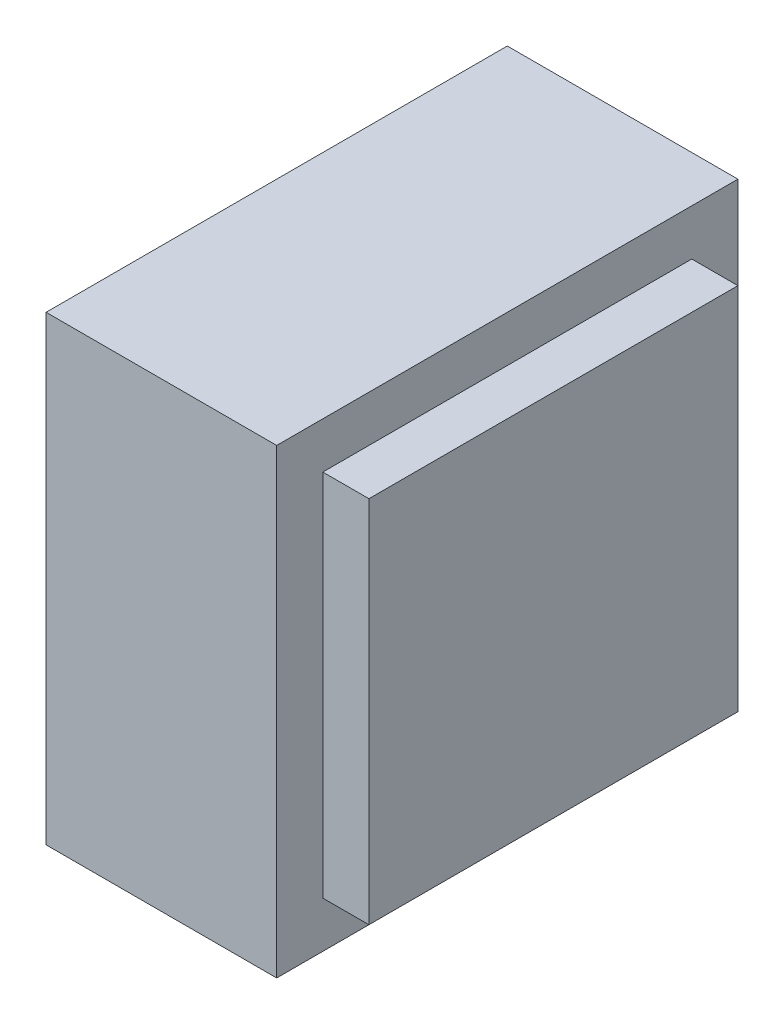
ISO-10303-21;
HEADER;
FILE_DESCRIPTION(('STEP AP214'),'2;1');
FILE_NAME('part.step','',(''),(''),'','','');
FILE_SCHEMA(('AUTOMOTIVE_DESIGN { 1 0 10303 214 1 1 1 1 }'));
ENDSEC;
DATA;
#1=APPLICATION_CONTEXT('core data for automotive mechanical design processes');
#2=APPLICATION_PROTOCOL_DEFINITION('international standard','automotive_design',2000,#1);
#3=PRODUCT_CONTEXT('',#1,'mechanical');
#4=PRODUCT('Part','Part','',(#3));
#5=PRODUCT_RELATED_PRODUCT_CATEGORY('part','',(#4));
#6=PRODUCT_DEFINITION_FORMATION('','',#4);
#7=PRODUCT_DEFINITION_CONTEXT('part definition',#1,'design');
#8=PRODUCT_DEFINITION('design','',#6,#7);
#9=PRODUCT_DEFINITION_SHAPE('','',#8);
#10=(LENGTH_UNIT() NAMED_UNIT(*) SI_UNIT(.MILLI.,.METRE.));
#11=(NAMED_UNIT(*) PLANE_ANGLE_UNIT() SI_UNIT($,.RADIAN.));
#12=(NAMED_UNIT(*) SI_UNIT($,.STERADIAN.) SOLID_ANGLE_UNIT());
#13=UNCERTAINTY_MEASURE_WITH_UNIT(LENGTH_MEASURE(1.E-05),#10,'distance_accuracy_value','');
#14=(GEOMETRIC_REPRESENTATION_CONTEXT(3) GLOBAL_UNCERTAINTY_ASSIGNED_CONTEXT((#13)) GLOBAL_UNIT_ASSIGNED_CONTEXT((#10,
#11,#12)) REPRESENTATION_CONTEXT('',''));
#15=CARTESIAN_POINT('',(0.,0.,0.));
#16=DIRECTION('',(0.,0.,1.));
#17=DIRECTION('',(1.,0.,0.));
#18=AXIS2_PLACEMENT_3D('',#15,#16,#17);
#19=CARTESIAN_POINT('',(1.,0.,0.));
#20=DIRECTION('',(1.,0.,0.));
#21=DIRECTION('',(0.,0.,-1.));
#22=AXIS2_PLACEMENT_3D('',#19,#20,#21);
#23=PLANE('',#22);
#24=DIRECTION('',(0.,1.,0.));
#25=VECTOR('',#24,1.);
#26=CARTESIAN_POINT('',(1.,1.,-1.));
#27=LINE('',#26,#25);
#28=CARTESIAN_POINT('',(1.,-1.,-1.));
#29=VERTEX_POINT('',#28);
#30=CARTESIAN_POINT('',(1.,1.,-1.));
#31=VERTEX_POINT('',#30);
#32=EDGE_CURVE('E141',#29,#31,#27,.T.);
#33=ORIENTED_EDGE('',*,*,#32,.T.);
#34=DIRECTION('',(0.,0.,1.));
#35=VECTOR('',#34,1.);
#36=CARTESIAN_POINT('',(1.,1.,1.));
#37=LINE('',#36,#35);
#38=CARTESIAN_POINT('',(1.,1.,1.));
#39=VERTEX_POINT('',#38);
#40=EDGE_CURVE('E86',#31,#39,#37,.T.);
#41=ORIENTED_EDGE('',*,*,#40,.T.);
#42=DIRECTION('',(0.,-1.,0.));
#43=VECTOR('',#42,1.);
#44=CARTESIAN_POINT('',(1.,1.,1.));
#45=LINE('',#44,#43);
#46=CARTESIAN_POINT('',(1.,-1.,1.));
#47=VERTEX_POINT('',#46);
#48=EDGE_CURVE('E144',#39,#47,#45,.T.);
#49=ORIENTED_EDGE('',*,*,#48,.T.);
#50=DIRECTION('',(0.,0.,-1.));
#51=VECTOR('',#50,1.);
#52=CARTESIAN_POINT('',(1.,-1.,1.));
#53=LINE('',#52,#51);
#54=EDGE_CURVE('E58',#47,#29,#53,.T.);
#55=ORIENTED_EDGE('',*,*,#54,.T.);
#56=EDGE_LOOP('',(#33,#41,#49,#55));
#57=FACE_BOUND('',#56,.T.);
#58=DIRECTION('',(0.,0.,1.));
#59=VECTOR('',#58,1.);
#60=CARTESIAN_POINT('',(1.,0.8,0.8));
#61=LINE('',#60,#59);
#62=CARTESIAN_POINT('',(1.,0.8,-0.8));
#63=VERTEX_POINT('',#62);
#64=CARTESIAN_POINT('',(1.,0.8,0.8));
#65=VERTEX_POINT('',#64);
#66=EDGE_CURVE('E268',#63,#65,#61,.T.);
#67=ORIENTED_EDGE('',*,*,#66,.F.);
#68=DIRECTION('',(0.,1.,0.));
#69=VECTOR('',#68,1.);
#70=CARTESIAN_POINT('',(1.,0.8,-0.8));
#71=LINE('',#70,#69);
#72=CARTESIAN_POINT('',(1.,-0.8,-0.8));
#73=VERTEX_POINT('',#72);
#74=EDGE_CURVE('E131',#73,#63,#71,.T.);
#75=ORIENTED_EDGE('',*,*,#74,.F.);
#76=DIRECTION('',(0.,0.,-1.));
#77=VECTOR('',#76,1.);
#78=CARTESIAN_POINT('',(1.,-0.8,0.8));
#79=LINE('',#78,#77);
#80=CARTESIAN_POINT('',(1.,-0.8,0.8));
#81=VERTEX_POINT('',#80);
#82=EDGE_CURVE('E127',#81,#73,#79,.T.);
#83=ORIENTED_EDGE('',*,*,#82,.F.);
#84=DIRECTION('',(0.,-1.,0.));
#85=VECTOR('',#84,1.);
#86=CARTESIAN_POINT('',(1.,0.8,0.8));
#87=LINE('',#86,#85);
#88=EDGE_CURVE('E265',#65,#81,#87,.T.);
#89=ORIENTED_EDGE('',*,*,#88,.F.);
#90=EDGE_LOOP('',(#67,#75,#83,#89));
#91=FACE_BOUND('',#90,.T.);
#92=ADVANCED_FACE('F34',(#57,#91),#23,.T.);
#93=CARTESIAN_POINT('',(1.,1.,-1.));
#94=DIRECTION('',(0.,0.,1.));
#95=DIRECTION('',(0.,-1.,0.));
#96=AXIS2_PLACEMENT_3D('',#93,#94,#95);
#97=PLANE('',#96);
#98=DIRECTION('',(0.,1.,0.));
#99=VECTOR('',#98,1.);
#100=CARTESIAN_POINT('',(0.,1.,-1.));
#101=LINE('',#100,#99);
#102=CARTESIAN_POINT('',(0.,-1.,-1.));
#103=VERTEX_POINT('',#102);
#104=CARTESIAN_POINT('',(0.,1.,-1.));
#105=VERTEX_POINT('',#104);
#106=EDGE_CURVE('E133',#103,#105,#101,.T.);
#107=ORIENTED_EDGE('',*,*,#106,.T.);
#108=DIRECTION('',(-1.,0.,0.));
#109=VECTOR('',#108,1.);
#110=CARTESIAN_POINT('',(1.,1.,-1.));
#111=LINE('',#110,#109);
#112=EDGE_CURVE('E11',#31,#105,#111,.T.);
#113=ORIENTED_EDGE('',*,*,#112,.F.);
#114=ORIENTED_EDGE('',*,*,#32,.F.);
#115=DIRECTION('',(-1.,0.,0.));
#116=VECTOR('',#115,1.);
#117=CARTESIAN_POINT('',(1.,-1.,-1.));
#118=LINE('',#117,#116);
#119=EDGE_CURVE('E146',#29,#103,#118,.T.);
#120=ORIENTED_EDGE('',*,*,#119,.T.);
#121=EDGE_LOOP('',(#107,#113,#114,#120));
#122=FACE_BOUND('',#121,.T.);
#123=ADVANCED_FACE('F36',(#122),#97,.F.);
#124=CARTESIAN_POINT('',(1.,1.,1.));
#125=DIRECTION('',(0.,-1.,0.));
#126=DIRECTION('',(0.,0.,-1.));
#127=AXIS2_PLACEMENT_3D('',#124,#125,#126);
#128=PLANE('',#127);
#129=DIRECTION('',(0.,0.,1.));
#130=VECTOR('',#129,1.);
#131=CARTESIAN_POINT('',(0.,1.,1.));
#132=LINE('',#131,#130);
#133=CARTESIAN_POINT('',(0.,1.,1.));
#134=VERTEX_POINT('',#133);
#135=EDGE_CURVE('E136',#105,#134,#132,.T.);
#136=ORIENTED_EDGE('',*,*,#135,.T.);
#137=DIRECTION('',(-1.,0.,0.));
#138=VECTOR('',#137,1.);
#139=CARTESIAN_POINT('',(1.,1.,1.));
#140=LINE('',#139,#138);
#141=EDGE_CURVE('E42',#39,#134,#140,.T.);
#142=ORIENTED_EDGE('',*,*,#141,.F.);
#143=ORIENTED_EDGE('',*,*,#40,.F.);
#144=ORIENTED_EDGE('',*,*,#112,.T.);
#145=EDGE_LOOP('',(#136,#142,#143,#144));
#146=FACE_BOUND('',#145,.T.);
#147=ADVANCED_FACE('F175',(#146),#128,.F.);
#148=CARTESIAN_POINT('',(1.,1.,1.));
#149=DIRECTION('',(0.,0.,-1.));
#150=DIRECTION('',(0.,1.,0.));
#151=AXIS2_PLACEMENT_3D('',#148,#149,#150);
#152=PLANE('',#151);
#153=DIRECTION('',(0.,-1.,0.));
#154=VECTOR('',#153,1.);
#155=CARTESIAN_POINT('',(0.,1.,1.));
#156=LINE('',#155,#154);
#157=CARTESIAN_POINT('',(0.,-1.,1.));
#158=VERTEX_POINT('',#157);
#159=EDGE_CURVE('E149',#134,#158,#156,.T.);
#160=ORIENTED_EDGE('',*,*,#159,.T.);
#161=DIRECTION('',(-1.,0.,0.));
#162=VECTOR('',#161,1.);
#163=CARTESIAN_POINT('',(1.,-1.,1.));
#164=LINE('',#163,#162);
#165=EDGE_CURVE('E153',#47,#158,#164,.T.);
#166=ORIENTED_EDGE('',*,*,#165,.F.);
#167=ORIENTED_EDGE('',*,*,#48,.F.);
#168=ORIENTED_EDGE('',*,*,#141,.T.);
#169=EDGE_LOOP('',(#160,#166,#167,#168));
#170=FACE_BOUND('',#169,.T.);
#171=ADVANCED_FACE('F158',(#170),#152,.F.);
#172=CARTESIAN_POINT('',(1.,-1.,1.));
#173=DIRECTION('',(0.,1.,0.));
#174=DIRECTION('',(0.,0.,1.));
#175=AXIS2_PLACEMENT_3D('',#172,#173,#174);
#176=PLANE('',#175);
#177=DIRECTION('',(0.,0.,-1.));
#178=VECTOR('',#177,1.);
#179=CARTESIAN_POINT('',(0.,-1.,1.));
#180=LINE('',#179,#178);
#181=EDGE_CURVE('E79',#158,#103,#180,.T.);
#182=ORIENTED_EDGE('',*,*,#181,.T.);
#183=ORIENTED_EDGE('',*,*,#119,.F.);
#184=ORIENTED_EDGE('',*,*,#54,.F.);
#185=ORIENTED_EDGE('',*,*,#165,.T.);
#186=EDGE_LOOP('',(#182,#183,#184,#185));
#187=FACE_BOUND('',#186,.T.);
#188=ADVANCED_FACE('F166',(#187),#176,.F.);
#189=CARTESIAN_POINT('',(0.,0.,0.));
#190=DIRECTION('',(1.,0.,0.));
#191=DIRECTION('',(0.,0.,-1.));
#192=AXIS2_PLACEMENT_3D('',#189,#190,#191);
#193=PLANE('',#192);
#194=ORIENTED_EDGE('',*,*,#106,.F.);
#195=ORIENTED_EDGE('',*,*,#181,.F.);
#196=ORIENTED_EDGE('',*,*,#159,.F.);
#197=ORIENTED_EDGE('',*,*,#135,.F.);
#198=EDGE_LOOP('',(#194,#195,#196,#197));
#199=FACE_BOUND('',#198,.T.);
#200=ADVANCED_FACE('F162',(#199),#193,.F.);
#201=CARTESIAN_POINT('',(1.2,0.8,-0.8));
#202=DIRECTION('',(0.,0.,1.));
#203=DIRECTION('',(0.,-1.,0.));
#204=AXIS2_PLACEMENT_3D('',#201,#202,#203);
#205=PLANE('',#204);
#206=ORIENTED_EDGE('',*,*,#74,.T.);
#207=DIRECTION('',(-1.,0.,0.));
#208=VECTOR('',#207,1.);
#209=CARTESIAN_POINT('',(1.2,0.8,-0.8));
#210=LINE('',#209,#208);
#211=CARTESIAN_POINT('',(1.2,0.8,-0.8));
#212=VERTEX_POINT('',#211);
#213=EDGE_CURVE('E112',#212,#63,#210,.T.);
#214=ORIENTED_EDGE('',*,*,#213,.F.);
#215=DIRECTION('',(0.,1.,0.));
#216=VECTOR('',#215,1.);
#217=CARTESIAN_POINT('',(1.2,0.8,-0.8));
#218=LINE('',#217,#216);
#219=CARTESIAN_POINT('',(1.2,-0.8,-0.8));
#220=VERTEX_POINT('',#219);
#221=EDGE_CURVE('E119',#220,#212,#218,.T.);
#222=ORIENTED_EDGE('',*,*,#221,.F.);
#223=DIRECTION('',(-1.,0.,0.));
#224=VECTOR('',#223,1.);
#225=CARTESIAN_POINT('',(1.2,-0.8,-0.8));
#226=LINE('',#225,#224);
#227=EDGE_CURVE('E263',#220,#73,#226,.T.);
#228=ORIENTED_EDGE('',*,*,#227,.T.);
#229=EDGE_LOOP('',(#206,#214,#222,#228));
#230=FACE_BOUND('',#229,.T.);
#231=ADVANCED_FACE('F129',(#230),#205,.F.);
#232=CARTESIAN_POINT('',(1.2,0.8,0.8));
#233=DIRECTION('',(0.,-1.,0.));
#234=DIRECTION('',(0.,0.,-1.));
#235=AXIS2_PLACEMENT_3D('',#232,#233,#234);
#236=PLANE('',#235);
#237=ORIENTED_EDGE('',*,*,#66,.T.);
#238=DIRECTION('',(-1.,0.,0.));
#239=VECTOR('',#238,1.);
#240=CARTESIAN_POINT('',(1.2,0.8,0.8));
#241=LINE('',#240,#239);
#242=CARTESIAN_POINT('',(1.2,0.8,0.8));
#243=VERTEX_POINT('',#242);
#244=EDGE_CURVE('E115',#243,#65,#241,.T.);
#245=ORIENTED_EDGE('',*,*,#244,.F.);
#246=DIRECTION('',(0.,0.,1.));
#247=VECTOR('',#246,1.);
#248=CARTESIAN_POINT('',(1.2,0.8,0.8));
#249=LINE('',#248,#247);
#250=EDGE_CURVE('E108',#212,#243,#249,.T.);
#251=ORIENTED_EDGE('',*,*,#250,.F.);
#252=ORIENTED_EDGE('',*,*,#213,.T.);
#253=EDGE_LOOP('',(#237,#245,#251,#252));
#254=FACE_BOUND('',#253,.T.);
#255=ADVANCED_FACE('F110',(#254),#236,.F.);
#256=CARTESIAN_POINT('',(1.2,0.8,0.8));
#257=DIRECTION('',(0.,0.,-1.));
#258=DIRECTION('',(0.,1.,0.));
#259=AXIS2_PLACEMENT_3D('',#256,#257,#258);
#260=PLANE('',#259);
#261=ORIENTED_EDGE('',*,*,#88,.T.);
#262=DIRECTION('',(-1.,0.,0.));
#263=VECTOR('',#262,1.);
#264=CARTESIAN_POINT('',(1.2,-0.8,0.8));
#265=LINE('',#264,#263);
#266=CARTESIAN_POINT('',(1.2,-0.8,0.8));
#267=VERTEX_POINT('',#266);
#268=EDGE_CURVE('E49',#267,#81,#265,.T.);
#269=ORIENTED_EDGE('',*,*,#268,.F.);
#270=DIRECTION('',(0.,-1.,0.));
#271=VECTOR('',#270,1.);
#272=CARTESIAN_POINT('',(1.2,0.8,0.8));
#273=LINE('',#272,#271);
#274=EDGE_CURVE('E118',#243,#267,#273,.T.);
#275=ORIENTED_EDGE('',*,*,#274,.F.);
#276=ORIENTED_EDGE('',*,*,#244,.T.);
#277=EDGE_LOOP('',(#261,#269,#275,#276));
#278=FACE_BOUND('',#277,.T.);
#279=ADVANCED_FACE('F188',(#278),#260,.F.);
#280=CARTESIAN_POINT('',(1.2,-0.8,0.8));
#281=DIRECTION('',(0.,1.,0.));
#282=DIRECTION('',(0.,0.,1.));
#283=AXIS2_PLACEMENT_3D('',#280,#281,#282);
#284=PLANE('',#283);
#285=ORIENTED_EDGE('',*,*,#82,.T.);
#286=ORIENTED_EDGE('',*,*,#227,.F.);
#287=DIRECTION('',(0.,0.,-1.));
#288=VECTOR('',#287,1.);
#289=CARTESIAN_POINT('',(1.2,-0.8,0.8));
#290=LINE('',#289,#288);
#291=EDGE_CURVE('E123',#267,#220,#290,.T.);
#292=ORIENTED_EDGE('',*,*,#291,.F.);
#293=ORIENTED_EDGE('',*,*,#268,.T.);
#294=EDGE_LOOP('',(#285,#286,#292,#293));
#295=FACE_BOUND('',#294,.T.);
#296=ADVANCED_FACE('F191',(#295),#284,.F.);
#297=CARTESIAN_POINT('',(1.2,0.,0.));
#298=DIRECTION('',(1.,0.,0.));
#299=DIRECTION('',(0.,0.,-1.));
#300=AXIS2_PLACEMENT_3D('',#297,#298,#299);
#301=PLANE('',#300);
#302=ORIENTED_EDGE('',*,*,#221,.T.);
#303=ORIENTED_EDGE('',*,*,#250,.T.);
#304=ORIENTED_EDGE('',*,*,#274,.T.);
#305=ORIENTED_EDGE('',*,*,#291,.T.);
#306=EDGE_LOOP('',(#302,#303,#304,#305));
#307=FACE_BOUND('',#306,.T.);
#308=ADVANCED_FACE('F122',(#307),#301,.T.);
#309=CLOSED_SHELL('',(#92,#123,#147,#171,#188,#200,#231,#255,#279,#296,#308));
#310=MANIFOLD_SOLID_BREP('B2',#309);
#311=ADVANCED_BREP_SHAPE_REPRESENTATION('',(#18,#310),#14);
#312=SHAPE_DEFINITION_REPRESENTATION(#9,#311);
ENDSEC;
END-ISO-10303-21;
